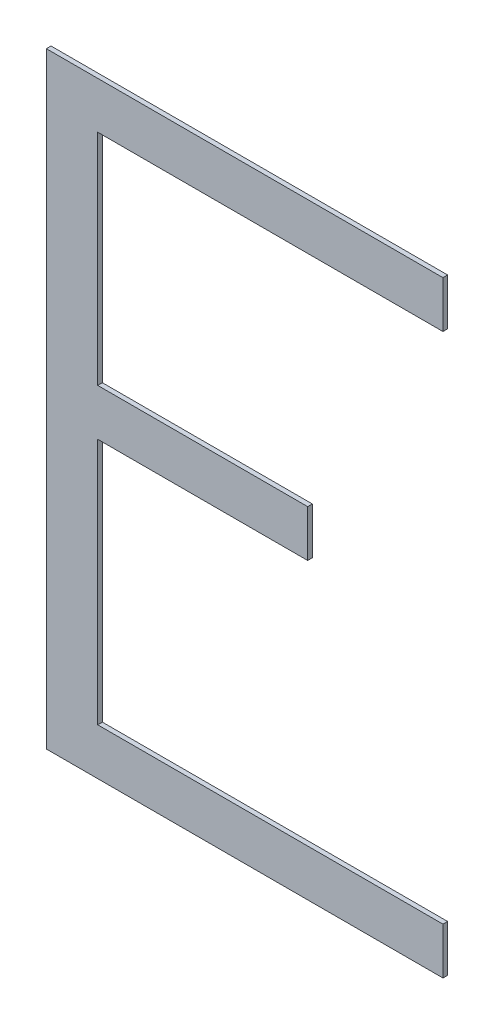
ISO-10303-21;
HEADER;
FILE_DESCRIPTION(('STEP AP214'),'2;1');
FILE_NAME('part.step','',(''),(''),'','','');
FILE_SCHEMA(('AUTOMOTIVE_DESIGN { 1 0 10303 214 1 1 1 1 }'));
ENDSEC;
DATA;
#1=APPLICATION_CONTEXT('core data for automotive mechanical design processes');
#2=APPLICATION_PROTOCOL_DEFINITION('international standard','automotive_design',2000,#1);
#3=PRODUCT_CONTEXT('',#1,'mechanical');
#4=PRODUCT('Part','Part','',(#3));
#5=PRODUCT_RELATED_PRODUCT_CATEGORY('part','',(#4));
#6=PRODUCT_DEFINITION_FORMATION('','',#4);
#7=PRODUCT_DEFINITION_CONTEXT('part definition',#1,'design');
#8=PRODUCT_DEFINITION('design','',#6,#7);
#9=PRODUCT_DEFINITION_SHAPE('','',#8);
#10=(LENGTH_UNIT() NAMED_UNIT(*) SI_UNIT(.MILLI.,.METRE.));
#11=(NAMED_UNIT(*) PLANE_ANGLE_UNIT() SI_UNIT($,.RADIAN.));
#12=(NAMED_UNIT(*) SI_UNIT($,.STERADIAN.) SOLID_ANGLE_UNIT());
#13=UNCERTAINTY_MEASURE_WITH_UNIT(LENGTH_MEASURE(1.E-05),#10,'distance_accuracy_value','');
#14=(GEOMETRIC_REPRESENTATION_CONTEXT(3) GLOBAL_UNCERTAINTY_ASSIGNED_CONTEXT((#13)) GLOBAL_UNIT_ASSIGNED_CONTEXT((#10,
#11,#12)) REPRESENTATION_CONTEXT('',''));
#15=CARTESIAN_POINT('',(0.,0.,0.));
#16=DIRECTION('',(0.,0.,1.));
#17=DIRECTION('',(1.,0.,0.));
#18=AXIS2_PLACEMENT_3D('',#15,#16,#17);
#19=CARTESIAN_POINT('',(-0.42500042,0.65000124,0.01));
#20=DIRECTION('',(0.,0.,1.));
#21=DIRECTION('',(1.,0.,0.));
#22=AXIS2_PLACEMENT_3D('',#19,#20,#21);
#23=PLANE('',#22);
#24=DIRECTION('',(0.,1.,0.));
#25=VECTOR('',#24,1.);
#26=CARTESIAN_POINT('',(0.42500042,0.65000124,0.01));
#27=LINE('',#26,#25);
#28=CARTESIAN_POINT('',(0.42500042,0.65000124,0.01));
#29=VERTEX_POINT('',#28);
#30=CARTESIAN_POINT('',(0.42500042,0.55000144,0.01));
#31=VERTEX_POINT('',#30);
#32=EDGE_CURVE('E157',#29,#31,#27,.F.);
#33=ORIENTED_EDGE('',*,*,#32,.F.);
#34=DIRECTION('',(1.,0.,0.));
#35=VECTOR('',#34,1.);
#36=CARTESIAN_POINT('',(-0.42500042,0.65000124,0.01));
#37=LINE('',#36,#35);
#38=CARTESIAN_POINT('',(-0.42500042,0.65000124,0.01));
#39=VERTEX_POINT('',#38);
#40=EDGE_CURVE('E118',#39,#29,#37,.T.);
#41=ORIENTED_EDGE('',*,*,#40,.F.);
#42=DIRECTION('',(0.,1.,0.));
#43=VECTOR('',#42,1.);
#44=CARTESIAN_POINT('',(-0.42500042,-0.6499987,0.01));
#45=LINE('',#44,#43);
#46=CARTESIAN_POINT('',(-0.42500042,-0.6499987,0.01));
#47=VERTEX_POINT('',#46);
#48=EDGE_CURVE('E20',#47,#39,#45,.T.);
#49=ORIENTED_EDGE('',*,*,#48,.F.);
#50=DIRECTION('',(1.,0.,0.));
#51=VECTOR('',#50,1.);
#52=CARTESIAN_POINT('',(0.42500042,-0.6499987,0.01));
#53=LINE('',#52,#51);
#54=CARTESIAN_POINT('',(0.42500042,-0.6499987,0.01));
#55=VERTEX_POINT('',#54);
#56=EDGE_CURVE('E107',#55,#47,#53,.F.);
#57=ORIENTED_EDGE('',*,*,#56,.F.);
#58=DIRECTION('',(0.,1.,0.));
#59=VECTOR('',#58,1.);
#60=CARTESIAN_POINT('',(0.42500042,-0.5499989,0.01));
#61=LINE('',#60,#59);
#62=CARTESIAN_POINT('',(0.42500042,-0.5499989,0.01));
#63=VERTEX_POINT('',#62);
#64=EDGE_CURVE('E102',#63,#55,#61,.F.);
#65=ORIENTED_EDGE('',*,*,#64,.F.);
#66=DIRECTION('',(1.,0.,0.));
#67=VECTOR('',#66,1.);
#68=CARTESIAN_POINT('',(-0.3149981,-0.5499989,0.01));
#69=LINE('',#68,#67);
#70=CARTESIAN_POINT('',(-0.3149981,-0.5499989,0.01));
#71=VERTEX_POINT('',#70);
#72=EDGE_CURVE('E129',#71,#63,#69,.T.);
#73=ORIENTED_EDGE('',*,*,#72,.F.);
#74=DIRECTION('',(0.,1.,0.));
#75=VECTOR('',#74,1.);
#76=CARTESIAN_POINT('',(-0.3149981,-0.01999741999998,0.01));
#77=LINE('',#76,#75);
#78=CARTESIAN_POINT('',(-0.3149981,-0.01999741999998,0.01));
#79=VERTEX_POINT('',#78);
#80=EDGE_CURVE('E133',#79,#71,#77,.F.);
#81=ORIENTED_EDGE('',*,*,#80,.F.);
#82=DIRECTION('',(1.,0.,0.));
#83=VECTOR('',#82,1.);
#84=CARTESIAN_POINT('',(0.135001,-0.01999741999998,0.01));
#85=LINE('',#84,#83);
#86=CARTESIAN_POINT('',(0.135001,-0.01999741999998,0.01));
#87=VERTEX_POINT('',#86);
#88=EDGE_CURVE('E137',#87,#79,#85,.F.);
#89=ORIENTED_EDGE('',*,*,#88,.F.);
#90=DIRECTION('',(0.,1.,0.));
#91=VECTOR('',#90,1.);
#92=CARTESIAN_POINT('',(0.135001,0.08000238,0.01));
#93=LINE('',#92,#91);
#94=CARTESIAN_POINT('',(0.135001,0.08000238,0.01));
#95=VERTEX_POINT('',#94);
#96=EDGE_CURVE('E141',#95,#87,#93,.F.);
#97=ORIENTED_EDGE('',*,*,#96,.F.);
#98=DIRECTION('',(1.,0.,0.));
#99=VECTOR('',#98,1.);
#100=CARTESIAN_POINT('',(-0.3149981,0.08000238,0.01));
#101=LINE('',#100,#99);
#102=CARTESIAN_POINT('',(-0.3149981,0.08000238,0.01));
#103=VERTEX_POINT('',#102);
#104=EDGE_CURVE('E145',#103,#95,#101,.T.);
#105=ORIENTED_EDGE('',*,*,#104,.F.);
#106=DIRECTION('',(0.,1.,0.));
#107=VECTOR('',#106,1.);
#108=CARTESIAN_POINT('',(-0.3149981,0.55000144,0.01));
#109=LINE('',#108,#107);
#110=CARTESIAN_POINT('',(-0.3149981,0.55000144,0.01));
#111=VERTEX_POINT('',#110);
#112=EDGE_CURVE('E149',#111,#103,#109,.F.);
#113=ORIENTED_EDGE('',*,*,#112,.F.);
#114=DIRECTION('',(1.,0.,0.));
#115=VECTOR('',#114,1.);
#116=CARTESIAN_POINT('',(0.42500042,0.55000144,0.01));
#117=LINE('',#116,#115);
#118=EDGE_CURVE('E153',#31,#111,#117,.F.);
#119=ORIENTED_EDGE('',*,*,#118,.F.);
#120=EDGE_LOOP('',(#33,#41,#49,#57,#65,#73,#81,#89,#97,#105,#113,#119));
#121=FACE_BOUND('',#120,.T.);
#122=ADVANCED_FACE('F17',(#121),#23,.T.);
#123=CARTESIAN_POINT('',(-0.42500042,-0.6499987,0.));
#124=DIRECTION('',(-1.,0.,0.));
#125=DIRECTION('',(0.,0.,1.));
#126=AXIS2_PLACEMENT_3D('',#123,#124,#125);
#127=PLANE('',#126);
#128=DIRECTION('',(0.,0.,1.));
#129=VECTOR('',#128,1.);
#130=CARTESIAN_POINT('',(-0.42500042,0.65000124,0.));
#131=LINE('',#130,#129);
#132=CARTESIAN_POINT('',(-0.42500042,0.65000124,0.));
#133=VERTEX_POINT('',#132);
#134=EDGE_CURVE('E161',#133,#39,#131,.T.);
#135=ORIENTED_EDGE('',*,*,#134,.F.);
#136=DIRECTION('',(0.,1.,0.));
#137=VECTOR('',#136,1.);
#138=CARTESIAN_POINT('',(-0.42500042,0.65000124,0.));
#139=LINE('',#138,#137);
#140=CARTESIAN_POINT('',(-0.42500042,-0.6499987,0.));
#141=VERTEX_POINT('',#140);
#142=EDGE_CURVE('E124',#133,#141,#139,.F.);
#143=ORIENTED_EDGE('',*,*,#142,.T.);
#144=DIRECTION('',(0.,0.,-1.));
#145=VECTOR('',#144,1.);
#146=CARTESIAN_POINT('',(-0.42500042,-0.6499987,0.));
#147=LINE('',#146,#145);
#148=EDGE_CURVE('E112',#47,#141,#147,.T.);
#149=ORIENTED_EDGE('',*,*,#148,.F.);
#150=ORIENTED_EDGE('',*,*,#48,.T.);
#151=EDGE_LOOP('',(#135,#143,#149,#150));
#152=FACE_BOUND('',#151,.T.);
#153=ADVANCED_FACE('F123',(#152),#127,.T.);
#154=CARTESIAN_POINT('',(0.42500042,-0.6499987,0.));
#155=DIRECTION('',(0.,-1.,0.));
#156=DIRECTION('',(0.,0.,-1.));
#157=AXIS2_PLACEMENT_3D('',#154,#155,#156);
#158=PLANE('',#157);
#159=ORIENTED_EDGE('',*,*,#148,.T.);
#160=DIRECTION('',(1.,0.,0.));
#161=VECTOR('',#160,1.);
#162=CARTESIAN_POINT('',(-0.42500042,-0.6499987,0.));
#163=LINE('',#162,#161);
#164=CARTESIAN_POINT('',(0.42500042,-0.6499987,0.));
#165=VERTEX_POINT('',#164);
#166=EDGE_CURVE('E166',#141,#165,#163,.T.);
#167=ORIENTED_EDGE('',*,*,#166,.T.);
#168=DIRECTION('',(0.,0.,-1.));
#169=VECTOR('',#168,1.);
#170=CARTESIAN_POINT('',(0.42500042,-0.6499987,0.));
#171=LINE('',#170,#169);
#172=EDGE_CURVE('E114',#55,#165,#171,.T.);
#173=ORIENTED_EDGE('',*,*,#172,.F.);
#174=ORIENTED_EDGE('',*,*,#56,.T.);
#175=EDGE_LOOP('',(#159,#167,#173,#174));
#176=FACE_BOUND('',#175,.T.);
#177=ADVANCED_FACE('F109',(#176),#158,.T.);
#178=CARTESIAN_POINT('',(0.42500042,-0.5499989,0.));
#179=DIRECTION('',(1.,0.,0.));
#180=DIRECTION('',(0.,0.,-1.));
#181=AXIS2_PLACEMENT_3D('',#178,#179,#180);
#182=PLANE('',#181);
#183=ORIENTED_EDGE('',*,*,#172,.T.);
#184=DIRECTION('',(0.,1.,0.));
#185=VECTOR('',#184,1.);
#186=CARTESIAN_POINT('',(0.42500042,0.65000124,0.));
#187=LINE('',#186,#185);
#188=CARTESIAN_POINT('',(0.42500042,-0.5499989,0.));
#189=VERTEX_POINT('',#188);
#190=EDGE_CURVE('E168',#165,#189,#187,.T.);
#191=ORIENTED_EDGE('',*,*,#190,.T.);
#192=DIRECTION('',(0.,0.,1.));
#193=VECTOR('',#192,1.);
#194=CARTESIAN_POINT('',(0.42500042,-0.5499989,0.));
#195=LINE('',#194,#193);
#196=EDGE_CURVE('E131',#63,#189,#195,.F.);
#197=ORIENTED_EDGE('',*,*,#196,.F.);
#198=ORIENTED_EDGE('',*,*,#64,.T.);
#199=EDGE_LOOP('',(#183,#191,#197,#198));
#200=FACE_BOUND('',#199,.T.);
#201=ADVANCED_FACE('F234',(#200),#182,.T.);
#202=CARTESIAN_POINT('',(-0.3149981,-0.5499989,0.));
#203=DIRECTION('',(0.,1.,0.));
#204=DIRECTION('',(0.,0.,1.));
#205=AXIS2_PLACEMENT_3D('',#202,#203,#204);
#206=PLANE('',#205);
#207=ORIENTED_EDGE('',*,*,#196,.T.);
#208=DIRECTION('',(1.,0.,0.));
#209=VECTOR('',#208,1.);
#210=CARTESIAN_POINT('',(-0.42500042,-0.5499989,0.));
#211=LINE('',#210,#209);
#212=CARTESIAN_POINT('',(-0.3149981,-0.5499989,0.));
#213=VERTEX_POINT('',#212);
#214=EDGE_CURVE('E171',#189,#213,#211,.F.);
#215=ORIENTED_EDGE('',*,*,#214,.T.);
#216=DIRECTION('',(0.,0.,-1.));
#217=VECTOR('',#216,1.);
#218=CARTESIAN_POINT('',(-0.3149981,-0.5499989,0.));
#219=LINE('',#218,#217);
#220=EDGE_CURVE('E135',#71,#213,#219,.T.);
#221=ORIENTED_EDGE('',*,*,#220,.F.);
#222=ORIENTED_EDGE('',*,*,#72,.T.);
#223=EDGE_LOOP('',(#207,#215,#221,#222));
#224=FACE_BOUND('',#223,.T.);
#225=ADVANCED_FACE('F233',(#224),#206,.T.);
#226=CARTESIAN_POINT('',(-0.3149981,-0.01999741999998,0.));
#227=DIRECTION('',(1.,0.,0.));
#228=DIRECTION('',(0.,0.,-1.));
#229=AXIS2_PLACEMENT_3D('',#226,#227,#228);
#230=PLANE('',#229);
#231=ORIENTED_EDGE('',*,*,#220,.T.);
#232=DIRECTION('',(0.,1.,0.));
#233=VECTOR('',#232,1.);
#234=CARTESIAN_POINT('',(-0.3149981,0.65000124,0.));
#235=LINE('',#234,#233);
#236=CARTESIAN_POINT('',(-0.3149981,-0.01999741999998,0.));
#237=VERTEX_POINT('',#236);
#238=EDGE_CURVE('E174',#213,#237,#235,.T.);
#239=ORIENTED_EDGE('',*,*,#238,.T.);
#240=DIRECTION('',(0.,0.,-1.));
#241=VECTOR('',#240,1.);
#242=CARTESIAN_POINT('',(-0.3149981,-0.01999741999998,0.));
#243=LINE('',#242,#241);
#244=EDGE_CURVE('E139',#79,#237,#243,.T.);
#245=ORIENTED_EDGE('',*,*,#244,.F.);
#246=ORIENTED_EDGE('',*,*,#80,.T.);
#247=EDGE_LOOP('',(#231,#239,#245,#246));
#248=FACE_BOUND('',#247,.T.);
#249=ADVANCED_FACE('F227',(#248),#230,.T.);
#250=CARTESIAN_POINT('',(0.135001,-0.01999741999998,0.));
#251=DIRECTION('',(0.,-1.,0.));
#252=DIRECTION('',(0.,0.,-1.));
#253=AXIS2_PLACEMENT_3D('',#250,#251,#252);
#254=PLANE('',#253);
#255=ORIENTED_EDGE('',*,*,#244,.T.);
#256=DIRECTION('',(1.,0.,0.));
#257=VECTOR('',#256,1.);
#258=CARTESIAN_POINT('',(-0.42500042,-0.01999741999998,0.));
#259=LINE('',#258,#257);
#260=CARTESIAN_POINT('',(0.135001,-0.01999741999998,0.));
#261=VERTEX_POINT('',#260);
#262=EDGE_CURVE('E177',#237,#261,#259,.T.);
#263=ORIENTED_EDGE('',*,*,#262,.T.);
#264=DIRECTION('',(0.,0.,-1.));
#265=VECTOR('',#264,1.);
#266=CARTESIAN_POINT('',(0.135001,-0.01999741999998,0.));
#267=LINE('',#266,#265);
#268=EDGE_CURVE('E143',#87,#261,#267,.T.);
#269=ORIENTED_EDGE('',*,*,#268,.F.);
#270=ORIENTED_EDGE('',*,*,#88,.T.);
#271=EDGE_LOOP('',(#255,#263,#269,#270));
#272=FACE_BOUND('',#271,.T.);
#273=ADVANCED_FACE('F223',(#272),#254,.T.);
#274=CARTESIAN_POINT('',(0.135001,0.08000238,0.));
#275=DIRECTION('',(1.,0.,0.));
#276=DIRECTION('',(0.,0.,-1.));
#277=AXIS2_PLACEMENT_3D('',#274,#275,#276);
#278=PLANE('',#277);
#279=ORIENTED_EDGE('',*,*,#268,.T.);
#280=DIRECTION('',(0.,1.,0.));
#281=VECTOR('',#280,1.);
#282=CARTESIAN_POINT('',(0.135001,0.65000124,0.));
#283=LINE('',#282,#281);
#284=CARTESIAN_POINT('',(0.135001,0.08000238,0.));
#285=VERTEX_POINT('',#284);
#286=EDGE_CURVE('E180',#261,#285,#283,.T.);
#287=ORIENTED_EDGE('',*,*,#286,.T.);
#288=DIRECTION('',(0.,0.,1.));
#289=VECTOR('',#288,1.);
#290=CARTESIAN_POINT('',(0.135001,0.08000238,0.));
#291=LINE('',#290,#289);
#292=EDGE_CURVE('E147',#95,#285,#291,.F.);
#293=ORIENTED_EDGE('',*,*,#292,.F.);
#294=ORIENTED_EDGE('',*,*,#96,.T.);
#295=EDGE_LOOP('',(#279,#287,#293,#294));
#296=FACE_BOUND('',#295,.T.);
#297=ADVANCED_FACE('F217',(#296),#278,.T.);
#298=CARTESIAN_POINT('',(-0.3149981,0.08000238,0.));
#299=DIRECTION('',(0.,1.,0.));
#300=DIRECTION('',(0.,0.,1.));
#301=AXIS2_PLACEMENT_3D('',#298,#299,#300);
#302=PLANE('',#301);
#303=ORIENTED_EDGE('',*,*,#292,.T.);
#304=DIRECTION('',(1.,0.,0.));
#305=VECTOR('',#304,1.);
#306=CARTESIAN_POINT('',(-0.42500042,0.08000238,0.));
#307=LINE('',#306,#305);
#308=CARTESIAN_POINT('',(-0.3149981,0.08000238,0.));
#309=VERTEX_POINT('',#308);
#310=EDGE_CURVE('E183',#285,#309,#307,.F.);
#311=ORIENTED_EDGE('',*,*,#310,.T.);
#312=DIRECTION('',(0.,0.,-1.));
#313=VECTOR('',#312,1.);
#314=CARTESIAN_POINT('',(-0.3149981,0.08000238,0.));
#315=LINE('',#314,#313);
#316=EDGE_CURVE('E151',#103,#309,#315,.T.);
#317=ORIENTED_EDGE('',*,*,#316,.F.);
#318=ORIENTED_EDGE('',*,*,#104,.T.);
#319=EDGE_LOOP('',(#303,#311,#317,#318));
#320=FACE_BOUND('',#319,.T.);
#321=ADVANCED_FACE('F213',(#320),#302,.T.);
#322=CARTESIAN_POINT('',(-0.3149981,0.55000144,0.));
#323=DIRECTION('',(1.,0.,0.));
#324=DIRECTION('',(0.,0.,-1.));
#325=AXIS2_PLACEMENT_3D('',#322,#323,#324);
#326=PLANE('',#325);
#327=ORIENTED_EDGE('',*,*,#316,.T.);
#328=DIRECTION('',(0.,1.,0.));
#329=VECTOR('',#328,1.);
#330=CARTESIAN_POINT('',(-0.3149981,0.65000124,0.));
#331=LINE('',#330,#329);
#332=CARTESIAN_POINT('',(-0.3149981,0.55000144,0.));
#333=VERTEX_POINT('',#332);
#334=EDGE_CURVE('E186',#309,#333,#331,.T.);
#335=ORIENTED_EDGE('',*,*,#334,.T.);
#336=DIRECTION('',(0.,0.,-1.));
#337=VECTOR('',#336,1.);
#338=CARTESIAN_POINT('',(-0.3149981,0.55000144,0.));
#339=LINE('',#338,#337);
#340=EDGE_CURVE('E155',#111,#333,#339,.T.);
#341=ORIENTED_EDGE('',*,*,#340,.F.);
#342=ORIENTED_EDGE('',*,*,#112,.T.);
#343=EDGE_LOOP('',(#327,#335,#341,#342));
#344=FACE_BOUND('',#343,.T.);
#345=ADVANCED_FACE('F207',(#344),#326,.T.);
#346=CARTESIAN_POINT('',(0.42500042,0.55000144,0.));
#347=DIRECTION('',(0.,-1.,0.));
#348=DIRECTION('',(0.,0.,-1.));
#349=AXIS2_PLACEMENT_3D('',#346,#347,#348);
#350=PLANE('',#349);
#351=ORIENTED_EDGE('',*,*,#340,.T.);
#352=DIRECTION('',(1.,0.,0.));
#353=VECTOR('',#352,1.);
#354=CARTESIAN_POINT('',(-0.42500042,0.55000144,0.));
#355=LINE('',#354,#353);
#356=CARTESIAN_POINT('',(0.42500042,0.55000144,0.));
#357=VERTEX_POINT('',#356);
#358=EDGE_CURVE('E189',#333,#357,#355,.T.);
#359=ORIENTED_EDGE('',*,*,#358,.T.);
#360=DIRECTION('',(0.,0.,-1.));
#361=VECTOR('',#360,1.);
#362=CARTESIAN_POINT('',(0.42500042,0.55000144,0.));
#363=LINE('',#362,#361);
#364=EDGE_CURVE('E159',#31,#357,#363,.T.);
#365=ORIENTED_EDGE('',*,*,#364,.F.);
#366=ORIENTED_EDGE('',*,*,#118,.T.);
#367=EDGE_LOOP('',(#351,#359,#365,#366));
#368=FACE_BOUND('',#367,.T.);
#369=ADVANCED_FACE('F202',(#368),#350,.T.);
#370=CARTESIAN_POINT('',(0.42500042,0.65000124,0.));
#371=DIRECTION('',(1.,0.,0.));
#372=DIRECTION('',(0.,0.,-1.));
#373=AXIS2_PLACEMENT_3D('',#370,#371,#372);
#374=PLANE('',#373);
#375=ORIENTED_EDGE('',*,*,#364,.T.);
#376=DIRECTION('',(0.,1.,0.));
#377=VECTOR('',#376,1.);
#378=CARTESIAN_POINT('',(0.42500042,0.65000124,0.));
#379=LINE('',#378,#377);
#380=CARTESIAN_POINT('',(0.42500042,0.65000124,0.));
#381=VERTEX_POINT('',#380);
#382=EDGE_CURVE('E26',#357,#381,#379,.T.);
#383=ORIENTED_EDGE('',*,*,#382,.T.);
#384=DIRECTION('',(0.,0.,1.));
#385=VECTOR('',#384,1.);
#386=CARTESIAN_POINT('',(0.42500042,0.65000124,0.));
#387=LINE('',#386,#385);
#388=EDGE_CURVE('E34',#29,#381,#387,.F.);
#389=ORIENTED_EDGE('',*,*,#388,.F.);
#390=ORIENTED_EDGE('',*,*,#32,.T.);
#391=EDGE_LOOP('',(#375,#383,#389,#390));
#392=FACE_BOUND('',#391,.T.);
#393=ADVANCED_FACE('F195',(#392),#374,.T.);
#394=CARTESIAN_POINT('',(-0.42500042,0.65000124,0.));
#395=DIRECTION('',(0.,1.,0.));
#396=DIRECTION('',(0.,0.,1.));
#397=AXIS2_PLACEMENT_3D('',#394,#395,#396);
#398=PLANE('',#397);
#399=ORIENTED_EDGE('',*,*,#388,.T.);
#400=DIRECTION('',(1.,0.,0.));
#401=VECTOR('',#400,1.);
#402=CARTESIAN_POINT('',(-0.42500042,0.65000124,0.));
#403=LINE('',#402,#401);
#404=EDGE_CURVE('E11',#381,#133,#403,.F.);
#405=ORIENTED_EDGE('',*,*,#404,.T.);
#406=ORIENTED_EDGE('',*,*,#134,.T.);
#407=ORIENTED_EDGE('',*,*,#40,.T.);
#408=EDGE_LOOP('',(#399,#405,#406,#407));
#409=FACE_BOUND('',#408,.T.);
#410=ADVANCED_FACE('F235',(#409),#398,.T.);
#411=CARTESIAN_POINT('',(-0.42500042,0.65000124,0.));
#412=DIRECTION('',(0.,0.,1.));
#413=DIRECTION('',(1.,0.,0.));
#414=AXIS2_PLACEMENT_3D('',#411,#412,#413);
#415=PLANE('',#414);
#416=ORIENTED_EDGE('',*,*,#382,.F.);
#417=ORIENTED_EDGE('',*,*,#358,.F.);
#418=ORIENTED_EDGE('',*,*,#334,.F.);
#419=ORIENTED_EDGE('',*,*,#310,.F.);
#420=ORIENTED_EDGE('',*,*,#286,.F.);
#421=ORIENTED_EDGE('',*,*,#262,.F.);
#422=ORIENTED_EDGE('',*,*,#238,.F.);
#423=ORIENTED_EDGE('',*,*,#214,.F.);
#424=ORIENTED_EDGE('',*,*,#190,.F.);
#425=ORIENTED_EDGE('',*,*,#166,.F.);
#426=ORIENTED_EDGE('',*,*,#142,.F.);
#427=ORIENTED_EDGE('',*,*,#404,.F.);
#428=EDGE_LOOP('',(#416,#417,#418,#419,#420,#421,#422,#423,#424,#425,#426,#427));
#429=FACE_BOUND('',#428,.T.);
#430=ADVANCED_FACE('F199',(#429),#415,.F.);
#431=CLOSED_SHELL('',(#122,#153,#177,#201,#225,#249,#273,#297,#321,#345,#369,#393,#410,#430));
#432=MANIFOLD_SOLID_BREP('B1',#431);
#433=ADVANCED_BREP_SHAPE_REPRESENTATION('',(#18,#432),#14);
#434=SHAPE_DEFINITION_REPRESENTATION(#9,#433);
ENDSEC;
END-ISO-10303-21;
